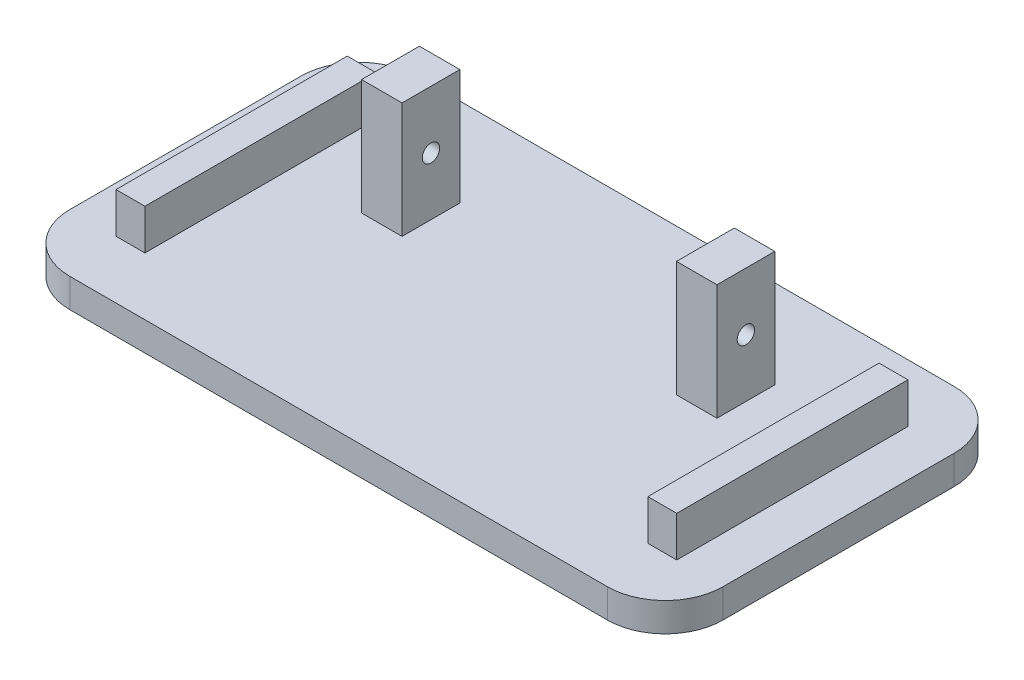
ISO-10303-21;
HEADER;
FILE_DESCRIPTION(('STEP AP214'),'2;1');
FILE_NAME('part.step','',(''),(''),'','','');
FILE_SCHEMA(('AUTOMOTIVE_DESIGN { 1 0 10303 214 1 1 1 1 }'));
ENDSEC;
DATA;
#1=APPLICATION_CONTEXT('core data for automotive mechanical design processes');
#2=APPLICATION_PROTOCOL_DEFINITION('international standard','automotive_design',2000,#1);
#3=PRODUCT_CONTEXT('',#1,'mechanical');
#4=PRODUCT('Part','Part','',(#3));
#5=PRODUCT_RELATED_PRODUCT_CATEGORY('part','',(#4));
#6=PRODUCT_DEFINITION_FORMATION('','',#4);
#7=PRODUCT_DEFINITION_CONTEXT('part definition',#1,'design');
#8=PRODUCT_DEFINITION('design','',#6,#7);
#9=PRODUCT_DEFINITION_SHAPE('','',#8);
#10=(LENGTH_UNIT() NAMED_UNIT(*) SI_UNIT(.MILLI.,.METRE.));
#11=(NAMED_UNIT(*) PLANE_ANGLE_UNIT() SI_UNIT($,.RADIAN.));
#12=(NAMED_UNIT(*) SI_UNIT($,.STERADIAN.) SOLID_ANGLE_UNIT());
#13=UNCERTAINTY_MEASURE_WITH_UNIT(LENGTH_MEASURE(1.E-05),#10,'distance_accuracy_value','');
#14=(GEOMETRIC_REPRESENTATION_CONTEXT(3) GLOBAL_UNCERTAINTY_ASSIGNED_CONTEXT((#13)) GLOBAL_UNIT_ASSIGNED_CONTEXT((#10,
#11,#12)) REPRESENTATION_CONTEXT('',''));
#15=CARTESIAN_POINT('',(0.,0.,0.));
#16=DIRECTION('',(0.,0.,1.));
#17=DIRECTION('',(1.,0.,0.));
#18=AXIS2_PLACEMENT_3D('',#15,#16,#17);
#19=CARTESIAN_POINT('',(79.785498489426,5.,-5.53323262839879));
#20=DIRECTION('',(0.,1.,0.));
#21=DIRECTION('',(0.,0.,1.));
#22=AXIS2_PLACEMENT_3D('',#19,#20,#21);
#23=PLANE('',#22);
#24=CARTESIAN_POINT('',(79.785498489426,5.,-5.53323262839879));
#25=DIRECTION('',(0.,1.,0.));
#26=DIRECTION('',(0.,0.,1.));
#27=AXIS2_PLACEMENT_3D('',#24,#25,#26);
#28=CIRCLE('',#27,10.);
#29=CARTESIAN_POINT('',(89.785498489426,5.,-5.53323262839872));
#30=VERTEX_POINT('',#29);
#31=CARTESIAN_POINT('',(79.7854984894259,5.,-15.5332326283988));
#32=VERTEX_POINT('',#31);
#33=EDGE_CURVE('E320',#30,#32,#28,.T.);
#34=ORIENTED_EDGE('',*,*,#33,.T.);
#35=DIRECTION('',(-1.,0.,0.));
#36=VECTOR('',#35,1.);
#37=CARTESIAN_POINT('',(-13.214501510574,5.,-15.5332326283988));
#38=LINE('',#37,#36);
#39=CARTESIAN_POINT('',(-13.214501510574,5.,-15.5332326283988));
#40=VERTEX_POINT('',#39);
#41=EDGE_CURVE('E323',#32,#40,#38,.T.);
#42=ORIENTED_EDGE('',*,*,#41,.T.);
#43=CARTESIAN_POINT('',(-13.214501510574,5.,-5.5332326283988));
#44=DIRECTION('',(0.,1.,0.));
#45=DIRECTION('',(0.,0.,-1.));
#46=AXIS2_PLACEMENT_3D('',#43,#44,#45);
#47=CIRCLE('',#46,10.);
#48=CARTESIAN_POINT('',(-23.214501510574,5.,-5.53323262839872));
#49=VERTEX_POINT('',#48);
#50=EDGE_CURVE('E326',#40,#49,#47,.T.);
#51=ORIENTED_EDGE('',*,*,#50,.T.);
#52=DIRECTION('',(0.,0.,1.));
#53=VECTOR('',#52,1.);
#54=CARTESIAN_POINT('',(-23.214501510574,5.,-5.53323262839872));
#55=LINE('',#54,#53);
#56=CARTESIAN_POINT('',(-23.214501510574,5.,34.4667673716011));
#57=VERTEX_POINT('',#56);
#58=EDGE_CURVE('E328',#49,#57,#55,.T.);
#59=ORIENTED_EDGE('',*,*,#58,.T.);
#60=CARTESIAN_POINT('',(-13.214501510574,5.,34.4667673716012));
#61=DIRECTION('',(0.,1.,0.));
#62=DIRECTION('',(0.,0.,-1.));
#63=AXIS2_PLACEMENT_3D('',#60,#61,#62);
#64=CIRCLE('',#63,10.);
#65=CARTESIAN_POINT('',(-13.214501510574,5.,44.4667673716012));
#66=VERTEX_POINT('',#65);
#67=EDGE_CURVE('E330',#57,#66,#64,.T.);
#68=ORIENTED_EDGE('',*,*,#67,.T.);
#69=DIRECTION('',(1.,0.,0.));
#70=VECTOR('',#69,1.);
#71=CARTESIAN_POINT('',(-13.214501510574,5.,44.4667673716012));
#72=LINE('',#71,#70);
#73=CARTESIAN_POINT('',(79.7854984894259,5.,44.4667673716012));
#74=VERTEX_POINT('',#73);
#75=EDGE_CURVE('E332',#66,#74,#72,.T.);
#76=ORIENTED_EDGE('',*,*,#75,.T.);
#77=CARTESIAN_POINT('',(79.785498489426,5.,34.4667673716012));
#78=DIRECTION('',(0.,1.,0.));
#79=DIRECTION('',(0.,0.,-1.));
#80=AXIS2_PLACEMENT_3D('',#77,#78,#79);
#81=CIRCLE('',#80,10.);
#82=CARTESIAN_POINT('',(89.785498489426,5.,34.4667673716011));
#83=VERTEX_POINT('',#82);
#84=EDGE_CURVE('E334',#74,#83,#81,.T.);
#85=ORIENTED_EDGE('',*,*,#84,.T.);
#86=DIRECTION('',(0.,0.,-1.));
#87=VECTOR('',#86,1.);
#88=CARTESIAN_POINT('',(89.785498489426,5.,-5.53323262839872));
#89=LINE('',#88,#87);
#90=EDGE_CURVE('E336',#83,#30,#89,.T.);
#91=ORIENTED_EDGE('',*,*,#90,.T.);
#92=EDGE_LOOP('',(#34,#42,#51,#59,#68,#76,#85,#91));
#93=FACE_BOUND('',#92,.T.);
#94=DIRECTION('',(1.,0.,0.));
#95=VECTOR('',#94,1.);
#96=CARTESIAN_POINT('',(2.54549848942599,5.,9.74755716237043));
#97=LINE('',#96,#95);
#98=CARTESIAN_POINT('',(2.54549848942599,5.,9.74755716237043));
#99=VERTEX_POINT('',#98);
#100=CARTESIAN_POINT('',(9.54549848942599,5.,9.74755716237043));
#101=VERTEX_POINT('',#100);
#102=EDGE_CURVE('E304',#99,#101,#97,.T.);
#103=ORIENTED_EDGE('',*,*,#102,.F.);
#104=DIRECTION('',(0.,0.,1.));
#105=VECTOR('',#104,1.);
#106=CARTESIAN_POINT('',(2.54549848942599,5.,-0.252442837629575));
#107=LINE('',#106,#105);
#108=CARTESIAN_POINT('',(2.54549848942599,5.,-0.252442837629575));
#109=VERTEX_POINT('',#108);
#110=EDGE_CURVE('E290',#109,#99,#107,.T.);
#111=ORIENTED_EDGE('',*,*,#110,.F.);
#112=DIRECTION('',(-1.,0.,0.));
#113=VECTOR('',#112,1.);
#114=CARTESIAN_POINT('',(2.54549848942599,5.,-0.252442837629575));
#115=LINE('',#114,#113);
#116=CARTESIAN_POINT('',(9.54549848942598,5.,-0.252442837629579));
#117=VERTEX_POINT('',#116);
#118=EDGE_CURVE('E295',#117,#109,#115,.T.);
#119=ORIENTED_EDGE('',*,*,#118,.F.);
#120=DIRECTION('',(0.,0.,-1.));
#121=VECTOR('',#120,1.);
#122=CARTESIAN_POINT('',(9.54549848942599,5.,-0.252442837629579));
#123=LINE('',#122,#121);
#124=EDGE_CURVE('E306',#101,#117,#123,.T.);
#125=ORIENTED_EDGE('',*,*,#124,.F.);
#126=EDGE_LOOP('',(#103,#111,#119,#125));
#127=FACE_BOUND('',#126,.T.);
#128=DIRECTION('',(0.,0.,1.));
#129=VECTOR('',#128,1.);
#130=CARTESIAN_POINT('',(57.025498489426,5.,-0.252442837629608));
#131=LINE('',#130,#129);
#132=CARTESIAN_POINT('',(57.025498489426,5.,-0.252442837629608));
#133=VERTEX_POINT('',#132);
#134=CARTESIAN_POINT('',(57.025498489426,5.,9.74755716237043));
#135=VERTEX_POINT('',#134);
#136=EDGE_CURVE('E275',#133,#135,#131,.T.);
#137=ORIENTED_EDGE('',*,*,#136,.F.);
#138=DIRECTION('',(-1.,0.,0.));
#139=VECTOR('',#138,1.);
#140=CARTESIAN_POINT('',(57.025498489426,5.,-0.252442837629608));
#141=LINE('',#140,#139);
#142=CARTESIAN_POINT('',(64.025498489426,5.,-0.252442837629614));
#143=VERTEX_POINT('',#142);
#144=EDGE_CURVE('E261',#143,#133,#141,.T.);
#145=ORIENTED_EDGE('',*,*,#144,.F.);
#146=DIRECTION('',(0.,0.,-1.));
#147=VECTOR('',#146,1.);
#148=CARTESIAN_POINT('',(64.025498489426,5.,-0.252442837629614));
#149=LINE('',#148,#147);
#150=CARTESIAN_POINT('',(64.025498489426,5.,9.74755716237043));
#151=VERTEX_POINT('',#150);
#152=EDGE_CURVE('E266',#151,#143,#149,.T.);
#153=ORIENTED_EDGE('',*,*,#152,.F.);
#154=DIRECTION('',(1.,0.,0.));
#155=VECTOR('',#154,1.);
#156=CARTESIAN_POINT('',(57.025498489426,5.,9.74755716237043));
#157=LINE('',#156,#155);
#158=EDGE_CURVE('E277',#135,#151,#157,.T.);
#159=ORIENTED_EDGE('',*,*,#158,.F.);
#160=EDGE_LOOP('',(#137,#145,#153,#159));
#161=FACE_BOUND('',#160,.T.);
#162=DIRECTION('',(1.,0.,0.));
#163=VECTOR('',#162,1.);
#164=CARTESIAN_POINT('',(-15.214501510574,5.,34.4667673716012));
#165=LINE('',#164,#163);
#166=CARTESIAN_POINT('',(-15.214501510574,5.,34.4667673716012));
#167=VERTEX_POINT('',#166);
#168=CARTESIAN_POINT('',(-10.214501510574,5.,34.4667673716012));
#169=VERTEX_POINT('',#168);
#170=EDGE_CURVE('E224',#167,#169,#165,.T.);
#171=ORIENTED_EDGE('',*,*,#170,.F.);
#172=DIRECTION('',(0.,0.,1.));
#173=VECTOR('',#172,1.);
#174=CARTESIAN_POINT('',(-15.214501510574,5.,-5.5332326283988));
#175=LINE('',#174,#173);
#176=CARTESIAN_POINT('',(-15.214501510574,5.,-5.5332326283988));
#177=VERTEX_POINT('',#176);
#178=EDGE_CURVE('E221',#177,#167,#175,.T.);
#179=ORIENTED_EDGE('',*,*,#178,.F.);
#180=DIRECTION('',(-1.,0.,0.));
#181=VECTOR('',#180,1.);
#182=CARTESIAN_POINT('',(-15.214501510574,5.,-5.5332326283988));
#183=LINE('',#182,#181);
#184=CARTESIAN_POINT('',(-10.214501510574,5.,-5.5332326283988));
#185=VERTEX_POINT('',#184);
#186=EDGE_CURVE('E233',#185,#177,#183,.T.);
#187=ORIENTED_EDGE('',*,*,#186,.F.);
#188=DIRECTION('',(0.,0.,-1.));
#189=VECTOR('',#188,1.);
#190=CARTESIAN_POINT('',(-10.214501510574,5.,-5.5332326283988));
#191=LINE('',#190,#189);
#192=EDGE_CURVE('E241',#169,#185,#191,.T.);
#193=ORIENTED_EDGE('',*,*,#192,.F.);
#194=EDGE_LOOP('',(#171,#179,#187,#193));
#195=FACE_BOUND('',#194,.T.);
#196=DIRECTION('',(1.,0.,0.));
#197=VECTOR('',#196,1.);
#198=CARTESIAN_POINT('',(76.785498489426,5.,34.4667673716012));
#199=LINE('',#198,#197);
#200=CARTESIAN_POINT('',(76.785498489426,5.,34.4667673716012));
#201=VERTEX_POINT('',#200);
#202=CARTESIAN_POINT('',(81.785498489426,5.,34.4667673716012));
#203=VERTEX_POINT('',#202);
#204=EDGE_CURVE('E709',#201,#203,#199,.T.);
#205=ORIENTED_EDGE('',*,*,#204,.F.);
#206=DIRECTION('',(0.,0.,1.));
#207=VECTOR('',#206,1.);
#208=CARTESIAN_POINT('',(76.7854984894259,5.,-5.5332326283988));
#209=LINE('',#208,#207);
#210=CARTESIAN_POINT('',(76.7854984894259,5.,-5.5332326283988));
#211=VERTEX_POINT('',#210);
#212=EDGE_CURVE('E219',#211,#201,#209,.T.);
#213=ORIENTED_EDGE('',*,*,#212,.F.);
#214=DIRECTION('',(-1.,0.,0.));
#215=VECTOR('',#214,1.);
#216=CARTESIAN_POINT('',(76.7854984894259,5.,-5.5332326283988));
#217=LINE('',#216,#215);
#218=CARTESIAN_POINT('',(81.785498489426,5.,-5.5332326283988));
#219=VERTEX_POINT('',#218);
#220=EDGE_CURVE('E215',#219,#211,#217,.T.);
#221=ORIENTED_EDGE('',*,*,#220,.F.);
#222=DIRECTION('',(0.,0.,-1.));
#223=VECTOR('',#222,1.);
#224=CARTESIAN_POINT('',(81.785498489426,5.,-5.5332326283988));
#225=LINE('',#224,#223);
#226=EDGE_CURVE('E706',#203,#219,#225,.T.);
#227=ORIENTED_EDGE('',*,*,#226,.F.);
#228=EDGE_LOOP('',(#205,#213,#221,#227));
#229=FACE_BOUND('',#228,.T.);
#230=ADVANCED_FACE('F33',(#93,#127,#161,#195,#229),#23,.T.);
#231=CARTESIAN_POINT('',(79.785498489426,5.,-5.53323262839879));
#232=DIRECTION('',(0.,-1.,0.));
#233=DIRECTION('',(0.,0.,-1.));
#234=AXIS2_PLACEMENT_3D('',#231,#232,#233);
#235=CYLINDRICAL_SURFACE('',#234,10.);
#236=CARTESIAN_POINT('',(79.785498489426,0.,-5.53323262839879));
#237=DIRECTION('',(0.,1.,0.));
#238=DIRECTION('',(0.,0.,1.));
#239=AXIS2_PLACEMENT_3D('',#236,#237,#238);
#240=CIRCLE('',#239,10.);
#241=CARTESIAN_POINT('',(89.785498489426,0.,-5.53323262839872));
#242=VERTEX_POINT('',#241);
#243=CARTESIAN_POINT('',(79.7854984894259,0.,-15.5332326283988));
#244=VERTEX_POINT('',#243);
#245=EDGE_CURVE('E319',#242,#244,#240,.T.);
#246=ORIENTED_EDGE('',*,*,#245,.T.);
#247=DIRECTION('',(0.,-1.,0.));
#248=VECTOR('',#247,1.);
#249=CARTESIAN_POINT('',(79.7854984894259,5.,-15.5332326283988));
#250=LINE('',#249,#248);
#251=EDGE_CURVE('E11',#32,#244,#250,.T.);
#252=ORIENTED_EDGE('',*,*,#251,.F.);
#253=ORIENTED_EDGE('',*,*,#33,.F.);
#254=DIRECTION('',(0.,-1.,0.));
#255=VECTOR('',#254,1.);
#256=CARTESIAN_POINT('',(89.785498489426,5.,-5.53323262839872));
#257=LINE('',#256,#255);
#258=EDGE_CURVE('E338',#30,#242,#257,.T.);
#259=ORIENTED_EDGE('',*,*,#258,.T.);
#260=EDGE_LOOP('',(#246,#252,#253,#259));
#261=FACE_BOUND('',#260,.T.);
#262=ADVANCED_FACE('F35',(#261),#235,.T.);
#263=CARTESIAN_POINT('',(-13.214501510574,5.,-15.5332326283988));
#264=DIRECTION('',(0.,0.,1.));
#265=DIRECTION('',(1.,0.,0.));
#266=AXIS2_PLACEMENT_3D('',#263,#264,#265);
#267=PLANE('',#266);
#268=DIRECTION('',(-1.,0.,0.));
#269=VECTOR('',#268,1.);
#270=CARTESIAN_POINT('',(-13.214501510574,0.,-15.5332326283988));
#271=LINE('',#270,#269);
#272=CARTESIAN_POINT('',(-13.214501510574,0.,-15.5332326283988));
#273=VERTEX_POINT('',#272);
#274=EDGE_CURVE('E341',#244,#273,#271,.T.);
#275=ORIENTED_EDGE('',*,*,#274,.T.);
#276=DIRECTION('',(0.,-1.,0.));
#277=VECTOR('',#276,1.);
#278=CARTESIAN_POINT('',(-13.214501510574,5.,-15.5332326283988));
#279=LINE('',#278,#277);
#280=EDGE_CURVE('E42',#40,#273,#279,.T.);
#281=ORIENTED_EDGE('',*,*,#280,.F.);
#282=ORIENTED_EDGE('',*,*,#41,.F.);
#283=ORIENTED_EDGE('',*,*,#251,.T.);
#284=EDGE_LOOP('',(#275,#281,#282,#283));
#285=FACE_BOUND('',#284,.T.);
#286=ADVANCED_FACE('F399',(#285),#267,.F.);
#287=CARTESIAN_POINT('',(-13.214501510574,5.,-5.5332326283988));
#288=DIRECTION('',(0.,-1.,0.));
#289=DIRECTION('',(0.,0.,-1.));
#290=AXIS2_PLACEMENT_3D('',#287,#288,#289);
#291=CYLINDRICAL_SURFACE('',#290,10.);
#292=CARTESIAN_POINT('',(-13.214501510574,0.,-5.5332326283988));
#293=DIRECTION('',(0.,1.,0.));
#294=DIRECTION('',(0.,0.,-1.));
#295=AXIS2_PLACEMENT_3D('',#292,#293,#294);
#296=CIRCLE('',#295,10.);
#297=CARTESIAN_POINT('',(-23.214501510574,0.,-5.53323262839872));
#298=VERTEX_POINT('',#297);
#299=EDGE_CURVE('E343',#273,#298,#296,.T.);
#300=ORIENTED_EDGE('',*,*,#299,.T.);
#301=DIRECTION('',(0.,-1.,0.));
#302=VECTOR('',#301,1.);
#303=CARTESIAN_POINT('',(-23.214501510574,5.,-5.53323262839872));
#304=LINE('',#303,#302);
#305=EDGE_CURVE('E368',#49,#298,#304,.T.);
#306=ORIENTED_EDGE('',*,*,#305,.F.);
#307=ORIENTED_EDGE('',*,*,#50,.F.);
#308=ORIENTED_EDGE('',*,*,#280,.T.);
#309=EDGE_LOOP('',(#300,#306,#307,#308));
#310=FACE_BOUND('',#309,.T.);
#311=ADVANCED_FACE('F376',(#310),#291,.T.);
#312=CARTESIAN_POINT('',(-23.214501510574,5.,-5.53323262839872));
#313=DIRECTION('',(1.,0.,0.));
#314=DIRECTION('',(0.,0.,-1.));
#315=AXIS2_PLACEMENT_3D('',#312,#313,#314);
#316=PLANE('',#315);
#317=DIRECTION('',(0.,0.,1.));
#318=VECTOR('',#317,1.);
#319=CARTESIAN_POINT('',(-23.214501510574,0.,-5.53323262839872));
#320=LINE('',#319,#318);
#321=CARTESIAN_POINT('',(-23.214501510574,0.,34.4667673716011));
#322=VERTEX_POINT('',#321);
#323=EDGE_CURVE('E345',#298,#322,#320,.T.);
#324=ORIENTED_EDGE('',*,*,#323,.T.);
#325=DIRECTION('',(0.,-1.,0.));
#326=VECTOR('',#325,1.);
#327=CARTESIAN_POINT('',(-23.214501510574,5.,34.4667673716011));
#328=LINE('',#327,#326);
#329=EDGE_CURVE('E365',#57,#322,#328,.T.);
#330=ORIENTED_EDGE('',*,*,#329,.F.);
#331=ORIENTED_EDGE('',*,*,#58,.F.);
#332=ORIENTED_EDGE('',*,*,#305,.T.);
#333=EDGE_LOOP('',(#324,#330,#331,#332));
#334=FACE_BOUND('',#333,.T.);
#335=ADVANCED_FACE('F387',(#334),#316,.F.);
#336=CARTESIAN_POINT('',(-13.214501510574,5.,34.4667673716012));
#337=DIRECTION('',(0.,-1.,0.));
#338=DIRECTION('',(0.,0.,-1.));
#339=AXIS2_PLACEMENT_3D('',#336,#337,#338);
#340=CYLINDRICAL_SURFACE('',#339,10.);
#341=CARTESIAN_POINT('',(-13.214501510574,0.,34.4667673716012));
#342=DIRECTION('',(0.,1.,0.));
#343=DIRECTION('',(0.,0.,-1.));
#344=AXIS2_PLACEMENT_3D('',#341,#342,#343);
#345=CIRCLE('',#344,10.);
#346=CARTESIAN_POINT('',(-13.214501510574,0.,44.4667673716012));
#347=VERTEX_POINT('',#346);
#348=EDGE_CURVE('E347',#322,#347,#345,.T.);
#349=ORIENTED_EDGE('',*,*,#348,.T.);
#350=DIRECTION('',(0.,-1.,0.));
#351=VECTOR('',#350,1.);
#352=CARTESIAN_POINT('',(-13.214501510574,5.,44.4667673716012));
#353=LINE('',#352,#351);
#354=EDGE_CURVE('E362',#66,#347,#353,.T.);
#355=ORIENTED_EDGE('',*,*,#354,.F.);
#356=ORIENTED_EDGE('',*,*,#67,.F.);
#357=ORIENTED_EDGE('',*,*,#329,.T.);
#358=EDGE_LOOP('',(#349,#355,#356,#357));
#359=FACE_BOUND('',#358,.T.);
#360=ADVANCED_FACE('F391',(#359),#340,.T.);
#361=CARTESIAN_POINT('',(-13.214501510574,5.,44.4667673716012));
#362=DIRECTION('',(0.,0.,-1.));
#363=DIRECTION('',(-1.,0.,0.));
#364=AXIS2_PLACEMENT_3D('',#361,#362,#363);
#365=PLANE('',#364);
#366=DIRECTION('',(1.,0.,0.));
#367=VECTOR('',#366,1.);
#368=CARTESIAN_POINT('',(-13.214501510574,0.,44.4667673716012));
#369=LINE('',#368,#367);
#370=CARTESIAN_POINT('',(79.7854984894259,0.,44.4667673716012));
#371=VERTEX_POINT('',#370);
#372=EDGE_CURVE('E349',#347,#371,#369,.T.);
#373=ORIENTED_EDGE('',*,*,#372,.T.);
#374=DIRECTION('',(0.,-1.,0.));
#375=VECTOR('',#374,1.);
#376=CARTESIAN_POINT('',(79.7854984894259,5.,44.4667673716012));
#377=LINE('',#376,#375);
#378=EDGE_CURVE('E359',#74,#371,#377,.T.);
#379=ORIENTED_EDGE('',*,*,#378,.F.);
#380=ORIENTED_EDGE('',*,*,#75,.F.);
#381=ORIENTED_EDGE('',*,*,#354,.T.);
#382=EDGE_LOOP('',(#373,#379,#380,#381));
#383=FACE_BOUND('',#382,.T.);
#384=ADVANCED_FACE('F412',(#383),#365,.F.);
#385=CARTESIAN_POINT('',(79.785498489426,5.,34.4667673716012));
#386=DIRECTION('',(0.,-1.,0.));
#387=DIRECTION('',(0.,0.,-1.));
#388=AXIS2_PLACEMENT_3D('',#385,#386,#387);
#389=CYLINDRICAL_SURFACE('',#388,10.);
#390=CARTESIAN_POINT('',(79.785498489426,0.,34.4667673716012));
#391=DIRECTION('',(0.,1.,0.));
#392=DIRECTION('',(0.,0.,-1.));
#393=AXIS2_PLACEMENT_3D('',#390,#391,#392);
#394=CIRCLE('',#393,10.);
#395=CARTESIAN_POINT('',(89.785498489426,0.,34.4667673716011));
#396=VERTEX_POINT('',#395);
#397=EDGE_CURVE('E351',#371,#396,#394,.T.);
#398=ORIENTED_EDGE('',*,*,#397,.T.);
#399=DIRECTION('',(0.,-1.,0.));
#400=VECTOR('',#399,1.);
#401=CARTESIAN_POINT('',(89.785498489426,5.,34.4667673716011));
#402=LINE('',#401,#400);
#403=EDGE_CURVE('E356',#83,#396,#402,.T.);
#404=ORIENTED_EDGE('',*,*,#403,.F.);
#405=ORIENTED_EDGE('',*,*,#84,.F.);
#406=ORIENTED_EDGE('',*,*,#378,.T.);
#407=EDGE_LOOP('',(#398,#404,#405,#406));
#408=FACE_BOUND('',#407,.T.);
#409=ADVANCED_FACE('F410',(#408),#389,.T.);
#410=CARTESIAN_POINT('',(89.785498489426,5.,-5.53323262839872));
#411=DIRECTION('',(-1.,0.,0.));
#412=DIRECTION('',(0.,0.,1.));
#413=AXIS2_PLACEMENT_3D('',#410,#411,#412);
#414=PLANE('',#413);
#415=DIRECTION('',(0.,0.,-1.));
#416=VECTOR('',#415,1.);
#417=CARTESIAN_POINT('',(89.785498489426,0.,-5.53323262839872));
#418=LINE('',#417,#416);
#419=EDGE_CURVE('E324',#396,#242,#418,.T.);
#420=ORIENTED_EDGE('',*,*,#419,.T.);
#421=ORIENTED_EDGE('',*,*,#258,.F.);
#422=ORIENTED_EDGE('',*,*,#90,.F.);
#423=ORIENTED_EDGE('',*,*,#403,.T.);
#424=EDGE_LOOP('',(#420,#421,#422,#423));
#425=FACE_BOUND('',#424,.T.);
#426=ADVANCED_FACE('F405',(#425),#414,.F.);
#427=CARTESIAN_POINT('',(79.785498489426,0.,-5.53323262839879));
#428=DIRECTION('',(0.,1.,0.));
#429=DIRECTION('',(0.,0.,1.));
#430=AXIS2_PLACEMENT_3D('',#427,#428,#429);
#431=PLANE('',#430);
#432=ORIENTED_EDGE('',*,*,#245,.F.);
#433=ORIENTED_EDGE('',*,*,#419,.F.);
#434=ORIENTED_EDGE('',*,*,#397,.F.);
#435=ORIENTED_EDGE('',*,*,#372,.F.);
#436=ORIENTED_EDGE('',*,*,#348,.F.);
#437=ORIENTED_EDGE('',*,*,#323,.F.);
#438=ORIENTED_EDGE('',*,*,#299,.F.);
#439=ORIENTED_EDGE('',*,*,#274,.F.);
#440=EDGE_LOOP('',(#432,#433,#434,#435,#436,#437,#438,#439));
#441=FACE_BOUND('',#440,.T.);
#442=ADVANCED_FACE('F382',(#441),#431,.F.);
#443=CARTESIAN_POINT('',(2.54549848942599,25.,-0.252442837629575));
#444=DIRECTION('',(1.,0.,0.));
#445=DIRECTION('',(0.,0.,-1.));
#446=AXIS2_PLACEMENT_3D('',#443,#444,#445);
#447=PLANE('',#446);
#448=CARTESIAN_POINT('',(2.54549848942599,15.,4.74755716237041));
#449=DIRECTION('',(-1.,0.,0.));
#450=DIRECTION('',(0.,0.,1.));
#451=AXIS2_PLACEMENT_3D('',#448,#449,#450);
#452=CIRCLE('',#451,1.5);
#453=CARTESIAN_POINT('',(2.54549848942599,15.,6.24755716237041));
#454=VERTEX_POINT('',#453);
#455=EDGE_CURVE('E252',#454,#454,#452,.T.);
#456=ORIENTED_EDGE('',*,*,#455,.F.);
#457=EDGE_LOOP('',(#456));
#458=FACE_BOUND('',#457,.T.);
#459=ORIENTED_EDGE('',*,*,#110,.T.);
#460=DIRECTION('',(0.,-1.,0.));
#461=VECTOR('',#460,1.);
#462=CARTESIAN_POINT('',(2.54549848942599,25.,9.74755716237043));
#463=LINE('',#462,#461);
#464=CARTESIAN_POINT('',(2.54549848942599,25.,9.74755716237043));
#465=VERTEX_POINT('',#464);
#466=EDGE_CURVE('E317',#465,#99,#463,.T.);
#467=ORIENTED_EDGE('',*,*,#466,.F.);
#468=DIRECTION('',(0.,0.,1.));
#469=VECTOR('',#468,1.);
#470=CARTESIAN_POINT('',(2.54549848942599,25.,-0.252442837629575));
#471=LINE('',#470,#469);
#472=CARTESIAN_POINT('',(2.54549848942599,25.,-0.252442837629575));
#473=VERTEX_POINT('',#472);
#474=EDGE_CURVE('E291',#473,#465,#471,.T.);
#475=ORIENTED_EDGE('',*,*,#474,.F.);
#476=DIRECTION('',(0.,-1.,0.));
#477=VECTOR('',#476,1.);
#478=CARTESIAN_POINT('',(2.54549848942599,25.,-0.252442837629575));
#479=LINE('',#478,#477);
#480=EDGE_CURVE('E301',#473,#109,#479,.T.);
#481=ORIENTED_EDGE('',*,*,#480,.T.);
#482=EDGE_LOOP('',(#459,#467,#475,#481));
#483=FACE_BOUND('',#482,.T.);
#484=ADVANCED_FACE('F428',(#458,#483),#447,.F.);
#485=CARTESIAN_POINT('',(2.54549848942599,25.,9.74755716237043));
#486=DIRECTION('',(0.,0.,-1.));
#487=DIRECTION('',(-1.,0.,0.));
#488=AXIS2_PLACEMENT_3D('',#485,#486,#487);
#489=PLANE('',#488);
#490=ORIENTED_EDGE('',*,*,#102,.T.);
#491=DIRECTION('',(0.,-1.,0.));
#492=VECTOR('',#491,1.);
#493=CARTESIAN_POINT('',(9.54549848942599,25.,9.74755716237043));
#494=LINE('',#493,#492);
#495=CARTESIAN_POINT('',(9.54549848942599,25.,9.74755716237043));
#496=VERTEX_POINT('',#495);
#497=EDGE_CURVE('E314',#496,#101,#494,.T.);
#498=ORIENTED_EDGE('',*,*,#497,.F.);
#499=DIRECTION('',(1.,0.,0.));
#500=VECTOR('',#499,1.);
#501=CARTESIAN_POINT('',(2.54549848942599,25.,9.74755716237043));
#502=LINE('',#501,#500);
#503=EDGE_CURVE('E294',#465,#496,#502,.T.);
#504=ORIENTED_EDGE('',*,*,#503,.F.);
#505=ORIENTED_EDGE('',*,*,#466,.T.);
#506=EDGE_LOOP('',(#490,#498,#504,#505));
#507=FACE_BOUND('',#506,.T.);
#508=ADVANCED_FACE('F448',(#507),#489,.F.);
#509=CARTESIAN_POINT('',(9.54549848942599,25.,-0.252442837629579));
#510=DIRECTION('',(-1.,0.,0.));
#511=DIRECTION('',(0.,0.,1.));
#512=AXIS2_PLACEMENT_3D('',#509,#510,#511);
#513=PLANE('',#512);
#514=CARTESIAN_POINT('',(9.54549848942598,15.,4.74755716237041));
#515=DIRECTION('',(-1.,0.,0.));
#516=DIRECTION('',(0.,0.,1.));
#517=AXIS2_PLACEMENT_3D('',#514,#515,#516);
#518=CIRCLE('',#517,1.5);
#519=CARTESIAN_POINT('',(9.54549848942598,15.,6.24755716237041));
#520=VERTEX_POINT('',#519);
#521=EDGE_CURVE('E258',#520,#520,#518,.T.);
#522=ORIENTED_EDGE('',*,*,#521,.T.);
#523=EDGE_LOOP('',(#522));
#524=FACE_BOUND('',#523,.T.);
#525=ORIENTED_EDGE('',*,*,#124,.T.);
#526=DIRECTION('',(0.,-1.,0.));
#527=VECTOR('',#526,1.);
#528=CARTESIAN_POINT('',(9.54549848942599,25.,-0.252442837629579));
#529=LINE('',#528,#527);
#530=CARTESIAN_POINT('',(9.54549848942599,25.,-0.252442837629579));
#531=VERTEX_POINT('',#530);
#532=EDGE_CURVE('E312',#531,#117,#529,.T.);
#533=ORIENTED_EDGE('',*,*,#532,.F.);
#534=DIRECTION('',(0.,0.,-1.));
#535=VECTOR('',#534,1.);
#536=CARTESIAN_POINT('',(9.54549848942599,25.,-0.252442837629579));
#537=LINE('',#536,#535);
#538=EDGE_CURVE('E297',#496,#531,#537,.T.);
#539=ORIENTED_EDGE('',*,*,#538,.F.);
#540=ORIENTED_EDGE('',*,*,#497,.T.);
#541=EDGE_LOOP('',(#525,#533,#539,#540));
#542=FACE_BOUND('',#541,.T.);
#543=ADVANCED_FACE('F456',(#524,#542),#513,.F.);
#544=CARTESIAN_POINT('',(2.54549848942599,25.,-0.252442837629575));
#545=DIRECTION('',(0.,0.,1.));
#546=DIRECTION('',(1.,0.,0.));
#547=AXIS2_PLACEMENT_3D('',#544,#545,#546);
#548=PLANE('',#547);
#549=ORIENTED_EDGE('',*,*,#118,.T.);
#550=ORIENTED_EDGE('',*,*,#480,.F.);
#551=DIRECTION('',(-1.,0.,0.));
#552=VECTOR('',#551,1.);
#553=CARTESIAN_POINT('',(2.54549848942599,25.,-0.252442837629575));
#554=LINE('',#553,#552);
#555=EDGE_CURVE('E299',#531,#473,#554,.T.);
#556=ORIENTED_EDGE('',*,*,#555,.F.);
#557=ORIENTED_EDGE('',*,*,#532,.T.);
#558=EDGE_LOOP('',(#549,#550,#556,#557));
#559=FACE_BOUND('',#558,.T.);
#560=ADVANCED_FACE('F463',(#559),#548,.F.);
#561=CARTESIAN_POINT('',(0.,25.,0.));
#562=DIRECTION('',(0.,1.,0.));
#563=DIRECTION('',(0.,0.,1.));
#564=AXIS2_PLACEMENT_3D('',#561,#562,#563);
#565=PLANE('',#564);
#566=ORIENTED_EDGE('',*,*,#474,.T.);
#567=ORIENTED_EDGE('',*,*,#503,.T.);
#568=ORIENTED_EDGE('',*,*,#538,.T.);
#569=ORIENTED_EDGE('',*,*,#555,.T.);
#570=EDGE_LOOP('',(#566,#567,#568,#569));
#571=FACE_BOUND('',#570,.T.);
#572=ADVANCED_FACE('F471',(#571),#565,.T.);
#573=CARTESIAN_POINT('',(57.025498489426,25.,-0.252442837629608));
#574=DIRECTION('',(0.,0.,1.));
#575=DIRECTION('',(1.,0.,0.));
#576=AXIS2_PLACEMENT_3D('',#573,#574,#575);
#577=PLANE('',#576);
#578=ORIENTED_EDGE('',*,*,#144,.T.);
#579=DIRECTION('',(0.,-1.,0.));
#580=VECTOR('',#579,1.);
#581=CARTESIAN_POINT('',(57.025498489426,25.,-0.252442837629608));
#582=LINE('',#581,#580);
#583=CARTESIAN_POINT('',(57.025498489426,25.,-0.252442837629608));
#584=VERTEX_POINT('',#583);
#585=EDGE_CURVE('E288',#584,#133,#582,.T.);
#586=ORIENTED_EDGE('',*,*,#585,.F.);
#587=DIRECTION('',(-1.,0.,0.));
#588=VECTOR('',#587,1.);
#589=CARTESIAN_POINT('',(57.025498489426,25.,-0.252442837629608));
#590=LINE('',#589,#588);
#591=CARTESIAN_POINT('',(64.025498489426,25.,-0.252442837629614));
#592=VERTEX_POINT('',#591);
#593=EDGE_CURVE('E262',#592,#584,#590,.T.);
#594=ORIENTED_EDGE('',*,*,#593,.F.);
#595=DIRECTION('',(0.,-1.,0.));
#596=VECTOR('',#595,1.);
#597=CARTESIAN_POINT('',(64.025498489426,25.,-0.252442837629614));
#598=LINE('',#597,#596);
#599=EDGE_CURVE('E272',#592,#143,#598,.T.);
#600=ORIENTED_EDGE('',*,*,#599,.T.);
#601=EDGE_LOOP('',(#578,#586,#594,#600));
#602=FACE_BOUND('',#601,.T.);
#603=ADVANCED_FACE('F479',(#602),#577,.F.);
#604=CARTESIAN_POINT('',(57.025498489426,25.,-0.252442837629608));
#605=DIRECTION('',(1.,0.,0.));
#606=DIRECTION('',(0.,0.,-1.));
#607=AXIS2_PLACEMENT_3D('',#604,#605,#606);
#608=PLANE('',#607);
#609=CARTESIAN_POINT('',(57.025498489426,15.,4.74755716237041));
#610=DIRECTION('',(1.,0.,0.));
#611=DIRECTION('',(0.,0.,-1.));
#612=AXIS2_PLACEMENT_3D('',#609,#610,#611);
#613=CIRCLE('',#612,1.5);
#614=CARTESIAN_POINT('',(57.025498489426,15.,3.24755716237041));
#615=VERTEX_POINT('',#614);
#616=EDGE_CURVE('E255',#615,#615,#613,.T.);
#617=ORIENTED_EDGE('',*,*,#616,.T.);
#618=EDGE_LOOP('',(#617));
#619=FACE_BOUND('',#618,.T.);
#620=ORIENTED_EDGE('',*,*,#136,.T.);
#621=DIRECTION('',(0.,-1.,0.));
#622=VECTOR('',#621,1.);
#623=CARTESIAN_POINT('',(57.025498489426,25.,9.74755716237043));
#624=LINE('',#623,#622);
#625=CARTESIAN_POINT('',(57.025498489426,25.,9.74755716237043));
#626=VERTEX_POINT('',#625);
#627=EDGE_CURVE('E285',#626,#135,#624,.T.);
#628=ORIENTED_EDGE('',*,*,#627,.F.);
#629=DIRECTION('',(0.,0.,1.));
#630=VECTOR('',#629,1.);
#631=CARTESIAN_POINT('',(57.025498489426,25.,-0.252442837629608));
#632=LINE('',#631,#630);
#633=EDGE_CURVE('E265',#584,#626,#632,.T.);
#634=ORIENTED_EDGE('',*,*,#633,.F.);
#635=ORIENTED_EDGE('',*,*,#585,.T.);
#636=EDGE_LOOP('',(#620,#628,#634,#635));
#637=FACE_BOUND('',#636,.T.);
#638=ADVANCED_FACE('F487',(#619,#637),#608,.F.);
#639=CARTESIAN_POINT('',(57.025498489426,25.,9.74755716237043));
#640=DIRECTION('',(0.,0.,-1.));
#641=DIRECTION('',(-1.,0.,0.));
#642=AXIS2_PLACEMENT_3D('',#639,#640,#641);
#643=PLANE('',#642);
#644=ORIENTED_EDGE('',*,*,#158,.T.);
#645=DIRECTION('',(0.,-1.,0.));
#646=VECTOR('',#645,1.);
#647=CARTESIAN_POINT('',(64.025498489426,25.,9.74755716237043));
#648=LINE('',#647,#646);
#649=CARTESIAN_POINT('',(64.025498489426,25.,9.74755716237043));
#650=VERTEX_POINT('',#649);
#651=EDGE_CURVE('E283',#650,#151,#648,.T.);
#652=ORIENTED_EDGE('',*,*,#651,.F.);
#653=DIRECTION('',(1.,0.,0.));
#654=VECTOR('',#653,1.);
#655=CARTESIAN_POINT('',(57.025498489426,25.,9.74755716237043));
#656=LINE('',#655,#654);
#657=EDGE_CURVE('E268',#626,#650,#656,.T.);
#658=ORIENTED_EDGE('',*,*,#657,.F.);
#659=ORIENTED_EDGE('',*,*,#627,.T.);
#660=EDGE_LOOP('',(#644,#652,#658,#659));
#661=FACE_BOUND('',#660,.T.);
#662=ADVANCED_FACE('F495',(#661),#643,.F.);
#663=CARTESIAN_POINT('',(64.025498489426,25.,-0.252442837629614));
#664=DIRECTION('',(-1.,0.,0.));
#665=DIRECTION('',(0.,0.,1.));
#666=AXIS2_PLACEMENT_3D('',#663,#664,#665);
#667=PLANE('',#666);
#668=CARTESIAN_POINT('',(64.025498489426,15.,4.74755716237041));
#669=DIRECTION('',(-1.,0.,0.));
#670=DIRECTION('',(0.,0.,1.));
#671=AXIS2_PLACEMENT_3D('',#668,#669,#670);
#672=CIRCLE('',#671,1.5);
#673=CARTESIAN_POINT('',(64.025498489426,15.,6.24755716237041));
#674=VERTEX_POINT('',#673);
#675=EDGE_CURVE('E37',#674,#674,#672,.T.);
#676=ORIENTED_EDGE('',*,*,#675,.T.);
#677=EDGE_LOOP('',(#676));
#678=FACE_BOUND('',#677,.T.);
#679=ORIENTED_EDGE('',*,*,#152,.T.);
#680=ORIENTED_EDGE('',*,*,#599,.F.);
#681=DIRECTION('',(0.,0.,-1.));
#682=VECTOR('',#681,1.);
#683=CARTESIAN_POINT('',(64.025498489426,25.,-0.252442837629614));
#684=LINE('',#683,#682);
#685=EDGE_CURVE('E270',#650,#592,#684,.T.);
#686=ORIENTED_EDGE('',*,*,#685,.F.);
#687=ORIENTED_EDGE('',*,*,#651,.T.);
#688=EDGE_LOOP('',(#679,#680,#686,#687));
#689=FACE_BOUND('',#688,.T.);
#690=ADVANCED_FACE('F503',(#678,#689),#667,.F.);
#691=CARTESIAN_POINT('',(0.,25.,0.));
#692=DIRECTION('',(0.,-1.,0.));
#693=DIRECTION('',(0.,0.,-1.));
#694=AXIS2_PLACEMENT_3D('',#691,#692,#693);
#695=PLANE('',#694);
#696=ORIENTED_EDGE('',*,*,#593,.T.);
#697=ORIENTED_EDGE('',*,*,#633,.T.);
#698=ORIENTED_EDGE('',*,*,#657,.T.);
#699=ORIENTED_EDGE('',*,*,#685,.T.);
#700=EDGE_LOOP('',(#696,#697,#698,#699));
#701=FACE_BOUND('',#700,.T.);
#702=ADVANCED_FACE('F510',(#701),#695,.F.);
#703=CARTESIAN_POINT('',(89.785498489426,15.,4.7475571623704));
#704=DIRECTION('',(-1.,0.,0.));
#705=DIRECTION('',(0.,0.,1.));
#706=AXIS2_PLACEMENT_3D('',#703,#704,#705);
#707=CYLINDRICAL_SURFACE('',#706,1.5);
#708=ORIENTED_EDGE('',*,*,#675,.F.);
#709=EDGE_LOOP('',(#708));
#710=FACE_BOUND('',#709,.T.);
#711=ORIENTED_EDGE('',*,*,#616,.F.);
#712=EDGE_LOOP('',(#711));
#713=FACE_BOUND('',#712,.T.);
#714=ADVANCED_FACE('F518',(#710,#713),#707,.F.);
#715=ORIENTED_EDGE('',*,*,#455,.T.);
#716=EDGE_LOOP('',(#715));
#717=FACE_BOUND('',#716,.T.);
#718=ORIENTED_EDGE('',*,*,#521,.F.);
#719=EDGE_LOOP('',(#718));
#720=FACE_BOUND('',#719,.T.);
#721=ADVANCED_FACE('F525',(#717,#720),#707,.F.);
#722=CARTESIAN_POINT('',(-15.214501510574,12.,-5.5332326283988));
#723=DIRECTION('',(1.,0.,0.));
#724=DIRECTION('',(0.,0.,-1.));
#725=AXIS2_PLACEMENT_3D('',#722,#723,#724);
#726=PLANE('',#725);
#727=ORIENTED_EDGE('',*,*,#178,.T.);
#728=DIRECTION('',(0.,-1.,0.));
#729=VECTOR('',#728,1.);
#730=CARTESIAN_POINT('',(-15.214501510574,12.,34.4667673716012));
#731=LINE('',#730,#729);
#732=CARTESIAN_POINT('',(-15.214501510574,12.,34.4667673716012));
#733=VERTEX_POINT('',#732);
#734=EDGE_CURVE('E250',#733,#167,#731,.T.);
#735=ORIENTED_EDGE('',*,*,#734,.F.);
#736=DIRECTION('',(0.,0.,1.));
#737=VECTOR('',#736,1.);
#738=CARTESIAN_POINT('',(-15.214501510574,12.,-5.5332326283988));
#739=LINE('',#738,#737);
#740=CARTESIAN_POINT('',(-15.214501510574,12.,-5.5332326283988));
#741=VERTEX_POINT('',#740);
#742=EDGE_CURVE('E229',#741,#733,#739,.T.);
#743=ORIENTED_EDGE('',*,*,#742,.F.);
#744=DIRECTION('',(0.,-1.,0.));
#745=VECTOR('',#744,1.);
#746=CARTESIAN_POINT('',(-15.214501510574,12.,-5.5332326283988));
#747=LINE('',#746,#745);
#748=EDGE_CURVE('E238',#741,#177,#747,.T.);
#749=ORIENTED_EDGE('',*,*,#748,.T.);
#750=EDGE_LOOP('',(#727,#735,#743,#749));
#751=FACE_BOUND('',#750,.T.);
#752=ADVANCED_FACE('F533',(#751),#726,.F.);
#753=CARTESIAN_POINT('',(-15.214501510574,12.,34.4667673716012));
#754=DIRECTION('',(0.,0.,-1.));
#755=DIRECTION('',(-1.,0.,0.));
#756=AXIS2_PLACEMENT_3D('',#753,#754,#755);
#757=PLANE('',#756);
#758=ORIENTED_EDGE('',*,*,#170,.T.);
#759=DIRECTION('',(0.,-1.,0.));
#760=VECTOR('',#759,1.);
#761=CARTESIAN_POINT('',(-10.214501510574,12.,34.4667673716012));
#762=LINE('',#761,#760);
#763=CARTESIAN_POINT('',(-10.214501510574,12.,34.4667673716012));
#764=VERTEX_POINT('',#763);
#765=EDGE_CURVE('E247',#764,#169,#762,.T.);
#766=ORIENTED_EDGE('',*,*,#765,.F.);
#767=DIRECTION('',(1.,0.,0.));
#768=VECTOR('',#767,1.);
#769=CARTESIAN_POINT('',(-15.214501510574,12.,34.4667673716012));
#770=LINE('',#769,#768);
#771=EDGE_CURVE('E232',#733,#764,#770,.T.);
#772=ORIENTED_EDGE('',*,*,#771,.F.);
#773=ORIENTED_EDGE('',*,*,#734,.T.);
#774=EDGE_LOOP('',(#758,#766,#772,#773));
#775=FACE_BOUND('',#774,.T.);
#776=ADVANCED_FACE('F540',(#775),#757,.F.);
#777=CARTESIAN_POINT('',(-10.214501510574,12.,-5.5332326283988));
#778=DIRECTION('',(-1.,0.,0.));
#779=DIRECTION('',(0.,0.,1.));
#780=AXIS2_PLACEMENT_3D('',#777,#778,#779);
#781=PLANE('',#780);
#782=ORIENTED_EDGE('',*,*,#192,.T.);
#783=DIRECTION('',(0.,-1.,0.));
#784=VECTOR('',#783,1.);
#785=CARTESIAN_POINT('',(-10.214501510574,12.,-5.5332326283988));
#786=LINE('',#785,#784);
#787=CARTESIAN_POINT('',(-10.214501510574,12.,-5.5332326283988));
#788=VERTEX_POINT('',#787);
#789=EDGE_CURVE('E57',#788,#185,#786,.T.);
#790=ORIENTED_EDGE('',*,*,#789,.F.);
#791=DIRECTION('',(0.,0.,-1.));
#792=VECTOR('',#791,1.);
#793=CARTESIAN_POINT('',(-10.214501510574,12.,-5.5332326283988));
#794=LINE('',#793,#792);
#795=EDGE_CURVE('E235',#764,#788,#794,.T.);
#796=ORIENTED_EDGE('',*,*,#795,.F.);
#797=ORIENTED_EDGE('',*,*,#765,.T.);
#798=EDGE_LOOP('',(#782,#790,#796,#797));
#799=FACE_BOUND('',#798,.T.);
#800=ADVANCED_FACE('F548',(#799),#781,.F.);
#801=CARTESIAN_POINT('',(-15.214501510574,12.,-5.5332326283988));
#802=DIRECTION('',(0.,0.,1.));
#803=DIRECTION('',(1.,0.,0.));
#804=AXIS2_PLACEMENT_3D('',#801,#802,#803);
#805=PLANE('',#804);
#806=ORIENTED_EDGE('',*,*,#186,.T.);
#807=ORIENTED_EDGE('',*,*,#748,.F.);
#808=DIRECTION('',(-1.,0.,0.));
#809=VECTOR('',#808,1.);
#810=CARTESIAN_POINT('',(-15.214501510574,12.,-5.5332326283988));
#811=LINE('',#810,#809);
#812=EDGE_CURVE('E237',#788,#741,#811,.T.);
#813=ORIENTED_EDGE('',*,*,#812,.F.);
#814=ORIENTED_EDGE('',*,*,#789,.T.);
#815=EDGE_LOOP('',(#806,#807,#813,#814));
#816=FACE_BOUND('',#815,.T.);
#817=ADVANCED_FACE('F556',(#816),#805,.F.);
#818=CARTESIAN_POINT('',(0.,12.,0.));
#819=DIRECTION('',(0.,1.,0.));
#820=DIRECTION('',(0.,0.,1.));
#821=AXIS2_PLACEMENT_3D('',#818,#819,#820);
#822=PLANE('',#821);
#823=ORIENTED_EDGE('',*,*,#742,.T.);
#824=ORIENTED_EDGE('',*,*,#771,.T.);
#825=ORIENTED_EDGE('',*,*,#795,.T.);
#826=ORIENTED_EDGE('',*,*,#812,.T.);
#827=EDGE_LOOP('',(#823,#824,#825,#826));
#828=FACE_BOUND('',#827,.T.);
#829=ADVANCED_FACE('F564',(#828),#822,.T.);
#830=CARTESIAN_POINT('',(76.7854984894259,12.,-5.5332326283988));
#831=DIRECTION('',(1.,0.,0.));
#832=DIRECTION('',(0.,0.,-1.));
#833=AXIS2_PLACEMENT_3D('',#830,#831,#832);
#834=PLANE('',#833);
#835=ORIENTED_EDGE('',*,*,#212,.T.);
#836=DIRECTION('',(0.,-1.,0.));
#837=VECTOR('',#836,1.);
#838=CARTESIAN_POINT('',(76.785498489426,12.,34.4667673716012));
#839=LINE('',#838,#837);
#840=CARTESIAN_POINT('',(76.785498489426,12.,34.4667673716012));
#841=VERTEX_POINT('',#840);
#842=EDGE_CURVE('E200',#841,#201,#839,.T.);
#843=ORIENTED_EDGE('',*,*,#842,.F.);
#844=DIRECTION('',(0.,0.,1.));
#845=VECTOR('',#844,1.);
#846=CARTESIAN_POINT('',(76.7854984894259,12.,-5.5332326283988));
#847=LINE('',#846,#845);
#848=CARTESIAN_POINT('',(76.7854984894259,12.,-5.5332326283988));
#849=VERTEX_POINT('',#848);
#850=EDGE_CURVE('E207',#849,#841,#847,.T.);
#851=ORIENTED_EDGE('',*,*,#850,.F.);
#852=DIRECTION('',(0.,-1.,0.));
#853=VECTOR('',#852,1.);
#854=CARTESIAN_POINT('',(76.7854984894259,12.,-5.5332326283988));
#855=LINE('',#854,#853);
#856=EDGE_CURVE('E703',#849,#211,#855,.T.);
#857=ORIENTED_EDGE('',*,*,#856,.T.);
#858=EDGE_LOOP('',(#835,#843,#851,#857));
#859=FACE_BOUND('',#858,.T.);
#860=ADVANCED_FACE('F217',(#859),#834,.F.);
#861=CARTESIAN_POINT('',(76.785498489426,12.,34.4667673716012));
#862=DIRECTION('',(0.,0.,-1.));
#863=DIRECTION('',(-1.,0.,0.));
#864=AXIS2_PLACEMENT_3D('',#861,#862,#863);
#865=PLANE('',#864);
#866=ORIENTED_EDGE('',*,*,#204,.T.);
#867=DIRECTION('',(0.,-1.,0.));
#868=VECTOR('',#867,1.);
#869=CARTESIAN_POINT('',(81.785498489426,12.,34.4667673716012));
#870=LINE('',#869,#868);
#871=CARTESIAN_POINT('',(81.785498489426,12.,34.4667673716012));
#872=VERTEX_POINT('',#871);
#873=EDGE_CURVE('E203',#872,#203,#870,.T.);
#874=ORIENTED_EDGE('',*,*,#873,.F.);
#875=DIRECTION('',(1.,0.,0.));
#876=VECTOR('',#875,1.);
#877=CARTESIAN_POINT('',(76.785498489426,12.,34.4667673716012));
#878=LINE('',#877,#876);
#879=EDGE_CURVE('E196',#841,#872,#878,.T.);
#880=ORIENTED_EDGE('',*,*,#879,.F.);
#881=ORIENTED_EDGE('',*,*,#842,.T.);
#882=EDGE_LOOP('',(#866,#874,#880,#881));
#883=FACE_BOUND('',#882,.T.);
#884=ADVANCED_FACE('F198',(#883),#865,.F.);
#885=CARTESIAN_POINT('',(81.785498489426,12.,-5.5332326283988));
#886=DIRECTION('',(-1.,0.,0.));
#887=DIRECTION('',(0.,0.,1.));
#888=AXIS2_PLACEMENT_3D('',#885,#886,#887);
#889=PLANE('',#888);
#890=ORIENTED_EDGE('',*,*,#226,.T.);
#891=DIRECTION('',(0.,-1.,0.));
#892=VECTOR('',#891,1.);
#893=CARTESIAN_POINT('',(81.785498489426,12.,-5.5332326283988));
#894=LINE('',#893,#892);
#895=CARTESIAN_POINT('',(81.785498489426,12.,-5.5332326283988));
#896=VERTEX_POINT('',#895);
#897=EDGE_CURVE('E49',#896,#219,#894,.T.);
#898=ORIENTED_EDGE('',*,*,#897,.F.);
#899=DIRECTION('',(0.,0.,-1.));
#900=VECTOR('',#899,1.);
#901=CARTESIAN_POINT('',(81.785498489426,12.,-5.5332326283988));
#902=LINE('',#901,#900);
#903=EDGE_CURVE('E206',#872,#896,#902,.T.);
#904=ORIENTED_EDGE('',*,*,#903,.F.);
#905=ORIENTED_EDGE('',*,*,#873,.T.);
#906=EDGE_LOOP('',(#890,#898,#904,#905));
#907=FACE_BOUND('',#906,.T.);
#908=ADVANCED_FACE('F584',(#907),#889,.F.);
#909=CARTESIAN_POINT('',(76.7854984894259,12.,-5.5332326283988));
#910=DIRECTION('',(0.,0.,1.));
#911=DIRECTION('',(1.,0.,0.));
#912=AXIS2_PLACEMENT_3D('',#909,#910,#911);
#913=PLANE('',#912);
#914=ORIENTED_EDGE('',*,*,#220,.T.);
#915=ORIENTED_EDGE('',*,*,#856,.F.);
#916=DIRECTION('',(-1.,0.,0.));
#917=VECTOR('',#916,1.);
#918=CARTESIAN_POINT('',(76.7854984894259,12.,-5.5332326283988));
#919=LINE('',#918,#917);
#920=EDGE_CURVE('E211',#896,#849,#919,.T.);
#921=ORIENTED_EDGE('',*,*,#920,.F.);
#922=ORIENTED_EDGE('',*,*,#897,.T.);
#923=EDGE_LOOP('',(#914,#915,#921,#922));
#924=FACE_BOUND('',#923,.T.);
#925=ADVANCED_FACE('F591',(#924),#913,.F.);
#926=CARTESIAN_POINT('',(0.,12.,0.));
#927=DIRECTION('',(0.,1.,0.));
#928=DIRECTION('',(0.,0.,1.));
#929=AXIS2_PLACEMENT_3D('',#926,#927,#928);
#930=PLANE('',#929);
#931=ORIENTED_EDGE('',*,*,#850,.T.);
#932=ORIENTED_EDGE('',*,*,#879,.T.);
#933=ORIENTED_EDGE('',*,*,#903,.T.);
#934=ORIENTED_EDGE('',*,*,#920,.T.);
#935=EDGE_LOOP('',(#931,#932,#933,#934));
#936=FACE_BOUND('',#935,.T.);
#937=ADVANCED_FACE('F210',(#936),#930,.T.);
#938=CLOSED_SHELL('',(#230,#262,#286,#311,#335,#360,#384,#409,#426,#442,#484,#508,#543,#560,
#572,#603,#638,#662,#690,#702,#714,#721,#752,#776,#800,#817,#829,#860,#884,#908,#925,#937));
#939=MANIFOLD_SOLID_BREP('B2',#938);
#940=ADVANCED_BREP_SHAPE_REPRESENTATION('',(#18,#939),#14);
#941=SHAPE_DEFINITION_REPRESENTATION(#9,#940);
ENDSEC;
END-ISO-10303-21;
